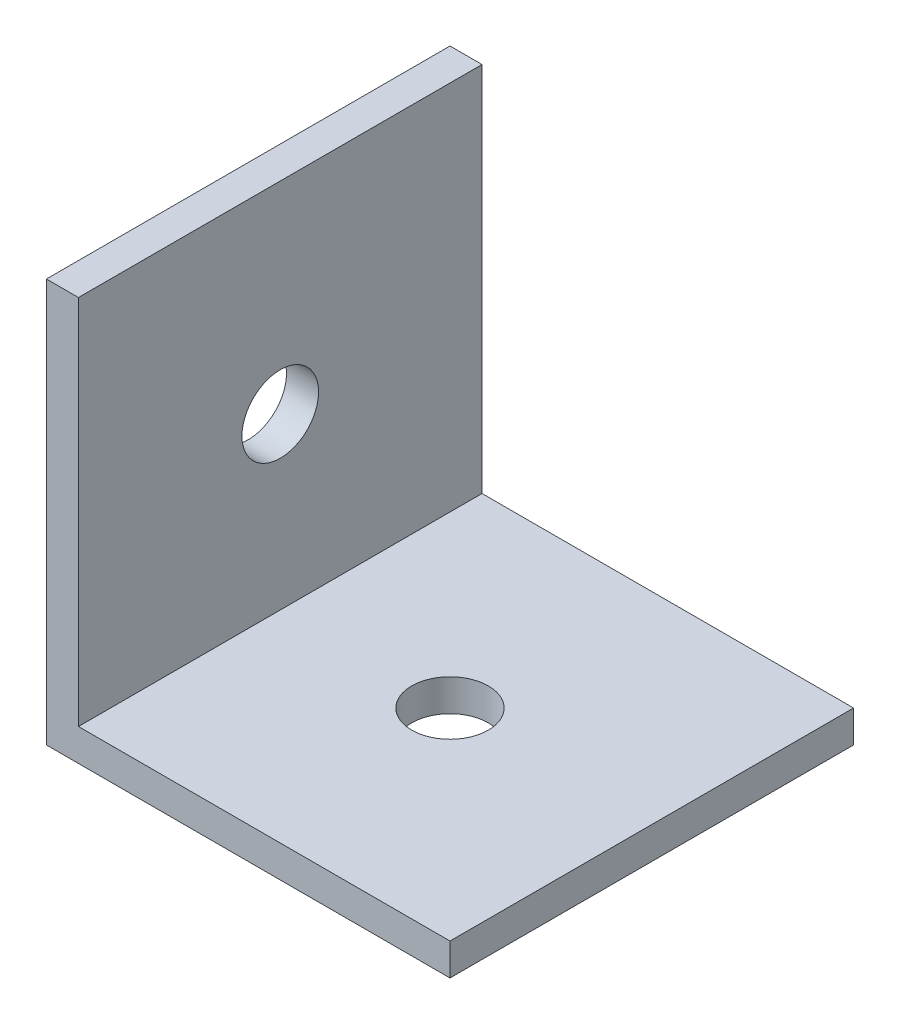
ISO-10303-21;
HEADER;
FILE_DESCRIPTION(('STEP AP214'),'2;1');
FILE_NAME('part.step','',(''),(''),'','','');
FILE_SCHEMA(('AUTOMOTIVE_DESIGN { 1 0 10303 214 1 1 1 1 }'));
ENDSEC;
DATA;
#1=APPLICATION_CONTEXT('core data for automotive mechanical design processes');
#2=APPLICATION_PROTOCOL_DEFINITION('international standard','automotive_design',2000,#1);
#3=PRODUCT_CONTEXT('',#1,'mechanical');
#4=PRODUCT('Part','Part','',(#3));
#5=PRODUCT_RELATED_PRODUCT_CATEGORY('part','',(#4));
#6=PRODUCT_DEFINITION_FORMATION('','',#4);
#7=PRODUCT_DEFINITION_CONTEXT('part definition',#1,'design');
#8=PRODUCT_DEFINITION('design','',#6,#7);
#9=PRODUCT_DEFINITION_SHAPE('','',#8);
#10=(LENGTH_UNIT() NAMED_UNIT(*) SI_UNIT(.MILLI.,.METRE.));
#11=(NAMED_UNIT(*) PLANE_ANGLE_UNIT() SI_UNIT($,.RADIAN.));
#12=(NAMED_UNIT(*) SI_UNIT($,.STERADIAN.) SOLID_ANGLE_UNIT());
#13=UNCERTAINTY_MEASURE_WITH_UNIT(LENGTH_MEASURE(1.E-05),#10,'distance_accuracy_value','');
#14=(GEOMETRIC_REPRESENTATION_CONTEXT(3) GLOBAL_UNCERTAINTY_ASSIGNED_CONTEXT((#13)) GLOBAL_UNIT_ASSIGNED_CONTEXT((#10,
#11,#12)) REPRESENTATION_CONTEXT('',''));
#15=CARTESIAN_POINT('',(0.,0.,0.));
#16=DIRECTION('',(0.,0.,1.));
#17=DIRECTION('',(1.,0.,0.));
#18=AXIS2_PLACEMENT_3D('',#15,#16,#17);
#19=CARTESIAN_POINT('',(1.58749999999996,1.58749999999996,9.99999999999999));
#20=DIRECTION('',(0.,-1.,0.));
#21=DIRECTION('',(0.,0.,-0.999999999999999));
#22=AXIS2_PLACEMENT_3D('',#19,#20,#21);
#23=PLANE('',#22);
#24=DIRECTION('',(-1.,0.,0.));
#25=VECTOR('',#24,1.);
#26=CARTESIAN_POINT('',(1.58749999999996,1.58749999999999,-9.99999999999997));
#27=LINE('',#26,#25);
#28=CARTESIAN_POINT('',(20.,1.58750000000002,-9.99999999999996));
#29=VERTEX_POINT('',#28);
#30=CARTESIAN_POINT('',(1.58749999999996,1.58749999999999,-9.99999999999997));
#31=VERTEX_POINT('',#30);
#32=EDGE_CURVE('E86',#29,#31,#27,.T.);
#33=ORIENTED_EDGE('',*,*,#32,.T.);
#34=DIRECTION('',(0.,0.,-0.999999999999999));
#35=VECTOR('',#34,1.);
#36=CARTESIAN_POINT('',(1.58749999999996,1.58749999999996,9.99999999999999));
#37=LINE('',#36,#35);
#38=CARTESIAN_POINT('',(1.58749999999996,1.58749999999996,9.99999999999999));
#39=VERTEX_POINT('',#38);
#40=EDGE_CURVE('E123',#39,#31,#37,.T.);
#41=ORIENTED_EDGE('',*,*,#40,.F.);
#42=DIRECTION('',(-1.,0.,0.));
#43=VECTOR('',#42,1.);
#44=CARTESIAN_POINT('',(1.58749999999996,1.58749999999996,9.99999999999999));
#45=LINE('',#44,#43);
#46=CARTESIAN_POINT('',(19.9999999999999,1.58749999999999,10.));
#47=VERTEX_POINT('',#46);
#48=EDGE_CURVE('E111',#47,#39,#45,.T.);
#49=ORIENTED_EDGE('',*,*,#48,.F.);
#50=DIRECTION('',(0.,0.,-0.999999999999999));
#51=VECTOR('',#50,1.);
#52=CARTESIAN_POINT('',(19.9999999999999,1.58749999999999,10.));
#53=LINE('',#52,#51);
#54=EDGE_CURVE('E118',#47,#29,#53,.T.);
#55=ORIENTED_EDGE('',*,*,#54,.T.);
#56=EDGE_LOOP('',(#33,#41,#49,#55));
#57=FACE_BOUND('',#56,.T.);
#58=CARTESIAN_POINT('',(10.,1.58749999999999,0.));
#59=DIRECTION('',(0.,-1.,0.));
#60=DIRECTION('',(0.,0.,-0.999999999999999));
#61=AXIS2_PLACEMENT_3D('',#58,#59,#60);
#62=CIRCLE('',#61,1.89864999999999);
#63=CARTESIAN_POINT('',(10.,1.58749999999999,-1.89865000000001));
#64=VERTEX_POINT('',#63);
#65=EDGE_CURVE('E135',#64,#64,#62,.F.);
#66=ORIENTED_EDGE('',*,*,#65,.F.);
#67=EDGE_LOOP('',(#66));
#68=FACE_BOUND('',#67,.T.);
#69=ADVANCED_FACE('F46',(#57,#68),#23,.F.);
#70=CARTESIAN_POINT('',(0.,20.,9.99999999999999));
#71=DIRECTION('',(0.,-1.,0.));
#72=DIRECTION('',(0.,0.,-0.999999999999999));
#73=AXIS2_PLACEMENT_3D('',#70,#71,#72);
#74=PLANE('',#73);
#75=DIRECTION('',(-1.,0.,0.));
#76=VECTOR('',#75,1.);
#77=CARTESIAN_POINT('',(-1.11022302462516E-13,20.,-10.));
#78=LINE('',#77,#76);
#79=CARTESIAN_POINT('',(1.58749999999991,20.,-10.));
#80=VERTEX_POINT('',#79);
#81=CARTESIAN_POINT('',(-1.11022302462516E-13,20.,-10.));
#82=VERTEX_POINT('',#81);
#83=EDGE_CURVE('E131',#80,#82,#78,.T.);
#84=ORIENTED_EDGE('',*,*,#83,.T.);
#85=DIRECTION('',(0.,0.,-0.999999999999999));
#86=VECTOR('',#85,1.);
#87=CARTESIAN_POINT('',(0.,20.,9.99999999999999));
#88=LINE('',#87,#86);
#89=CARTESIAN_POINT('',(0.,20.,9.99999999999999));
#90=VERTEX_POINT('',#89);
#91=EDGE_CURVE('E13',#90,#82,#88,.T.);
#92=ORIENTED_EDGE('',*,*,#91,.F.);
#93=DIRECTION('',(-1.,0.,0.));
#94=VECTOR('',#93,1.);
#95=CARTESIAN_POINT('',(0.,20.,9.99999999999999));
#96=LINE('',#95,#94);
#97=CARTESIAN_POINT('',(1.58750000000002,20.,9.99999999999998));
#98=VERTEX_POINT('',#97);
#99=EDGE_CURVE('E142',#98,#90,#96,.T.);
#100=ORIENTED_EDGE('',*,*,#99,.F.);
#101=DIRECTION('',(0.,0.,-0.999999999999999));
#102=VECTOR('',#101,1.);
#103=CARTESIAN_POINT('',(1.58750000000002,20.,9.99999999999998));
#104=LINE('',#103,#102);
#105=EDGE_CURVE('E127',#98,#80,#104,.T.);
#106=ORIENTED_EDGE('',*,*,#105,.T.);
#107=EDGE_LOOP('',(#84,#92,#100,#106));
#108=FACE_BOUND('',#107,.T.);
#109=ADVANCED_FACE('F48',(#108),#74,.F.);
#110=CARTESIAN_POINT('',(0.,20.,9.99999999999999));
#111=DIRECTION('',(1.,0.,0.));
#112=DIRECTION('',(0.,0.,-0.999999999999999));
#113=AXIS2_PLACEMENT_3D('',#110,#111,#112);
#114=PLANE('',#113);
#115=CARTESIAN_POINT('',(-1.11022302462516E-13,9.99999999999998,0.));
#116=DIRECTION('',(-1.,0.,0.));
#117=DIRECTION('',(0.,0.,0.999999999999999));
#118=AXIS2_PLACEMENT_3D('',#115,#116,#117);
#119=CIRCLE('',#118,1.89864999999999);
#120=CARTESIAN_POINT('',(-1.10389924978804E-13,9.99999999999998,1.89864999999999));
#121=VERTEX_POINT('',#120);
#122=EDGE_CURVE('E182',#121,#121,#119,.T.);
#123=ORIENTED_EDGE('',*,*,#122,.F.);
#124=EDGE_LOOP('',(#123));
#125=FACE_BOUND('',#124,.T.);
#126=DIRECTION('',(0.,-1.,0.));
#127=VECTOR('',#126,1.);
#128=CARTESIAN_POINT('',(-1.11022302462516E-13,20.,-10.));
#129=LINE('',#128,#127);
#130=CARTESIAN_POINT('',(0.,0.,-9.99999999999998));
#131=VERTEX_POINT('',#130);
#132=EDGE_CURVE('E134',#82,#131,#129,.T.);
#133=ORIENTED_EDGE('',*,*,#132,.T.);
#134=DIRECTION('',(0.,0.,-0.999999999999999));
#135=VECTOR('',#134,1.);
#136=CARTESIAN_POINT('',(0.,0.,9.99999999999997));
#137=LINE('',#136,#135);
#138=CARTESIAN_POINT('',(0.,0.,9.99999999999997));
#139=VERTEX_POINT('',#138);
#140=EDGE_CURVE('E55',#139,#131,#137,.T.);
#141=ORIENTED_EDGE('',*,*,#140,.F.);
#142=DIRECTION('',(0.,-1.,0.));
#143=VECTOR('',#142,1.);
#144=CARTESIAN_POINT('',(0.,20.,9.99999999999999));
#145=LINE('',#144,#143);
#146=EDGE_CURVE('E100',#90,#139,#145,.T.);
#147=ORIENTED_EDGE('',*,*,#146,.F.);
#148=ORIENTED_EDGE('',*,*,#91,.T.);
#149=EDGE_LOOP('',(#133,#141,#147,#148));
#150=FACE_BOUND('',#149,.T.);
#151=ADVANCED_FACE('F172',(#125,#150),#114,.F.);
#152=CARTESIAN_POINT('',(0.,0.,9.99999999999997));
#153=DIRECTION('',(0.,1.,0.));
#154=DIRECTION('',(0.,0.,0.999999999999999));
#155=AXIS2_PLACEMENT_3D('',#152,#153,#154);
#156=PLANE('',#155);
#157=CARTESIAN_POINT('',(10.,0.,0.));
#158=DIRECTION('',(0.,-1.,0.));
#159=DIRECTION('',(0.,0.,-0.999999999999999));
#160=AXIS2_PLACEMENT_3D('',#157,#158,#159);
#161=CIRCLE('',#160,1.89864999999999);
#162=CARTESIAN_POINT('',(10.,0.,-1.89865));
#163=VERTEX_POINT('',#162);
#164=EDGE_CURVE('E187',#163,#163,#161,.T.);
#165=ORIENTED_EDGE('',*,*,#164,.F.);
#166=EDGE_LOOP('',(#165));
#167=FACE_BOUND('',#166,.T.);
#168=DIRECTION('',(1.,0.,0.));
#169=VECTOR('',#168,1.);
#170=CARTESIAN_POINT('',(0.,0.,-9.99999999999998));
#171=LINE('',#170,#169);
#172=CARTESIAN_POINT('',(20.,0.,-9.99999999999995));
#173=VERTEX_POINT('',#172);
#174=EDGE_CURVE('E137',#131,#173,#171,.T.);
#175=ORIENTED_EDGE('',*,*,#174,.T.);
#176=DIRECTION('',(0.,0.,-0.999999999999999));
#177=VECTOR('',#176,1.);
#178=CARTESIAN_POINT('',(20.,0.,10.));
#179=LINE('',#178,#177);
#180=CARTESIAN_POINT('',(20.,0.,10.));
#181=VERTEX_POINT('',#180);
#182=EDGE_CURVE('E122',#181,#173,#179,.T.);
#183=ORIENTED_EDGE('',*,*,#182,.F.);
#184=DIRECTION('',(1.,0.,0.));
#185=VECTOR('',#184,1.);
#186=CARTESIAN_POINT('',(0.,0.,9.99999999999997));
#187=LINE('',#186,#185);
#188=EDGE_CURVE('E113',#139,#181,#187,.T.);
#189=ORIENTED_EDGE('',*,*,#188,.F.);
#190=ORIENTED_EDGE('',*,*,#140,.T.);
#191=EDGE_LOOP('',(#175,#183,#189,#190));
#192=FACE_BOUND('',#191,.T.);
#193=ADVANCED_FACE('F148',(#167,#192),#156,.F.);
#194=CARTESIAN_POINT('',(19.9999999999999,1.58749999999999,10.));
#195=DIRECTION('',(-1.,0.,0.));
#196=DIRECTION('',(0.,0.,0.999999999999999));
#197=AXIS2_PLACEMENT_3D('',#194,#195,#196);
#198=PLANE('',#197);
#199=DIRECTION('',(0.,1.,0.));
#200=VECTOR('',#199,1.);
#201=CARTESIAN_POINT('',(20.,1.58750000000002,-9.99999999999996));
#202=LINE('',#201,#200);
#203=EDGE_CURVE('E121',#173,#29,#202,.T.);
#204=ORIENTED_EDGE('',*,*,#203,.T.);
#205=ORIENTED_EDGE('',*,*,#54,.F.);
#206=DIRECTION('',(0.,1.,0.));
#207=VECTOR('',#206,1.);
#208=CARTESIAN_POINT('',(19.9999999999999,1.58749999999999,10.));
#209=LINE('',#208,#207);
#210=EDGE_CURVE('E107',#181,#47,#209,.T.);
#211=ORIENTED_EDGE('',*,*,#210,.F.);
#212=ORIENTED_EDGE('',*,*,#182,.T.);
#213=EDGE_LOOP('',(#204,#205,#211,#212));
#214=FACE_BOUND('',#213,.T.);
#215=ADVANCED_FACE('F119',(#214),#198,.F.);
#216=CARTESIAN_POINT('',(1.58750000000002,20.,9.99999999999998));
#217=DIRECTION('',(-1.,0.,0.));
#218=DIRECTION('',(0.,0.,0.999999999999999));
#219=AXIS2_PLACEMENT_3D('',#216,#217,#218);
#220=PLANE('',#219);
#221=CARTESIAN_POINT('',(1.58749999999991,9.99999999999998,0.));
#222=DIRECTION('',(-1.,0.,0.));
#223=DIRECTION('',(0.,0.,0.999999999999999));
#224=AXIS2_PLACEMENT_3D('',#221,#222,#223);
#225=CIRCLE('',#224,1.89864999999999);
#226=CARTESIAN_POINT('',(1.58749999999991,9.99999999999998,1.89865));
#227=VERTEX_POINT('',#226);
#228=EDGE_CURVE('E184',#227,#227,#225,.F.);
#229=ORIENTED_EDGE('',*,*,#228,.F.);
#230=EDGE_LOOP('',(#229));
#231=FACE_BOUND('',#230,.T.);
#232=DIRECTION('',(0.,1.,0.));
#233=VECTOR('',#232,1.);
#234=CARTESIAN_POINT('',(1.58749999999991,20.,-10.));
#235=LINE('',#234,#233);
#236=EDGE_CURVE('E92',#31,#80,#235,.T.);
#237=ORIENTED_EDGE('',*,*,#236,.T.);
#238=ORIENTED_EDGE('',*,*,#105,.F.);
#239=DIRECTION('',(0.,1.,0.));
#240=VECTOR('',#239,1.);
#241=CARTESIAN_POINT('',(1.58750000000002,20.,9.99999999999998));
#242=LINE('',#241,#240);
#243=EDGE_CURVE('E63',#39,#98,#242,.T.);
#244=ORIENTED_EDGE('',*,*,#243,.F.);
#245=ORIENTED_EDGE('',*,*,#40,.T.);
#246=EDGE_LOOP('',(#237,#238,#244,#245));
#247=FACE_BOUND('',#246,.T.);
#248=ADVANCED_FACE('F155',(#231,#247),#220,.F.);
#249=CARTESIAN_POINT('',(0.,0.,9.99999999999997));
#250=DIRECTION('',(0.,0.,-0.999999999999999));
#251=DIRECTION('',(-1.,0.,0.));
#252=AXIS2_PLACEMENT_3D('',#249,#250,#251);
#253=PLANE('',#252);
#254=ORIENTED_EDGE('',*,*,#99,.T.);
#255=ORIENTED_EDGE('',*,*,#146,.T.);
#256=ORIENTED_EDGE('',*,*,#188,.T.);
#257=ORIENTED_EDGE('',*,*,#210,.T.);
#258=ORIENTED_EDGE('',*,*,#48,.T.);
#259=ORIENTED_EDGE('',*,*,#243,.T.);
#260=EDGE_LOOP('',(#254,#255,#256,#257,#258,#259));
#261=FACE_BOUND('',#260,.T.);
#262=ADVANCED_FACE('F109',(#261),#253,.F.);
#263=CARTESIAN_POINT('',(0.,0.,-9.99999999999998));
#264=DIRECTION('',(0.,0.,-0.999999999999999));
#265=DIRECTION('',(-1.,0.,0.));
#266=AXIS2_PLACEMENT_3D('',#263,#264,#265);
#267=PLANE('',#266);
#268=ORIENTED_EDGE('',*,*,#83,.F.);
#269=ORIENTED_EDGE('',*,*,#236,.F.);
#270=ORIENTED_EDGE('',*,*,#32,.F.);
#271=ORIENTED_EDGE('',*,*,#203,.F.);
#272=ORIENTED_EDGE('',*,*,#174,.F.);
#273=ORIENTED_EDGE('',*,*,#132,.F.);
#274=EDGE_LOOP('',(#268,#269,#270,#271,#272,#273));
#275=FACE_BOUND('',#274,.T.);
#276=ADVANCED_FACE('F151',(#275),#267,.T.);
#277=CARTESIAN_POINT('',(10.,0.,0.));
#278=DIRECTION('',(0.,-1.,0.));
#279=DIRECTION('',(0.,0.,-0.999999999999999));
#280=AXIS2_PLACEMENT_3D('',#277,#278,#279);
#281=CYLINDRICAL_SURFACE('',#280,1.89864999999999);
#282=ORIENTED_EDGE('',*,*,#65,.T.);
#283=EDGE_LOOP('',(#282));
#284=FACE_BOUND('',#283,.T.);
#285=ORIENTED_EDGE('',*,*,#164,.T.);
#286=EDGE_LOOP('',(#285));
#287=FACE_BOUND('',#286,.T.);
#288=ADVANCED_FACE('F197',(#284,#287),#281,.F.);
#289=CARTESIAN_POINT('',(-1.11022302462516E-13,9.99999999999998,0.));
#290=DIRECTION('',(-1.,0.,0.));
#291=DIRECTION('',(0.,0.,0.999999999999999));
#292=AXIS2_PLACEMENT_3D('',#289,#290,#291);
#293=CYLINDRICAL_SURFACE('',#292,1.89864999999999);
#294=ORIENTED_EDGE('',*,*,#228,.T.);
#295=EDGE_LOOP('',(#294));
#296=FACE_BOUND('',#295,.T.);
#297=ORIENTED_EDGE('',*,*,#122,.T.);
#298=EDGE_LOOP('',(#297));
#299=FACE_BOUND('',#298,.T.);
#300=ADVANCED_FACE('F199',(#296,#299),#293,.F.);
#301=CLOSED_SHELL('',(#69,#109,#151,#193,#215,#248,#262,#276,#288,#300));
#302=MANIFOLD_SOLID_BREP('B2',#301);
#303=ADVANCED_BREP_SHAPE_REPRESENTATION('',(#18,#302),#14);
#304=SHAPE_DEFINITION_REPRESENTATION(#9,#303);
ENDSEC;
END-ISO-10303-21;
